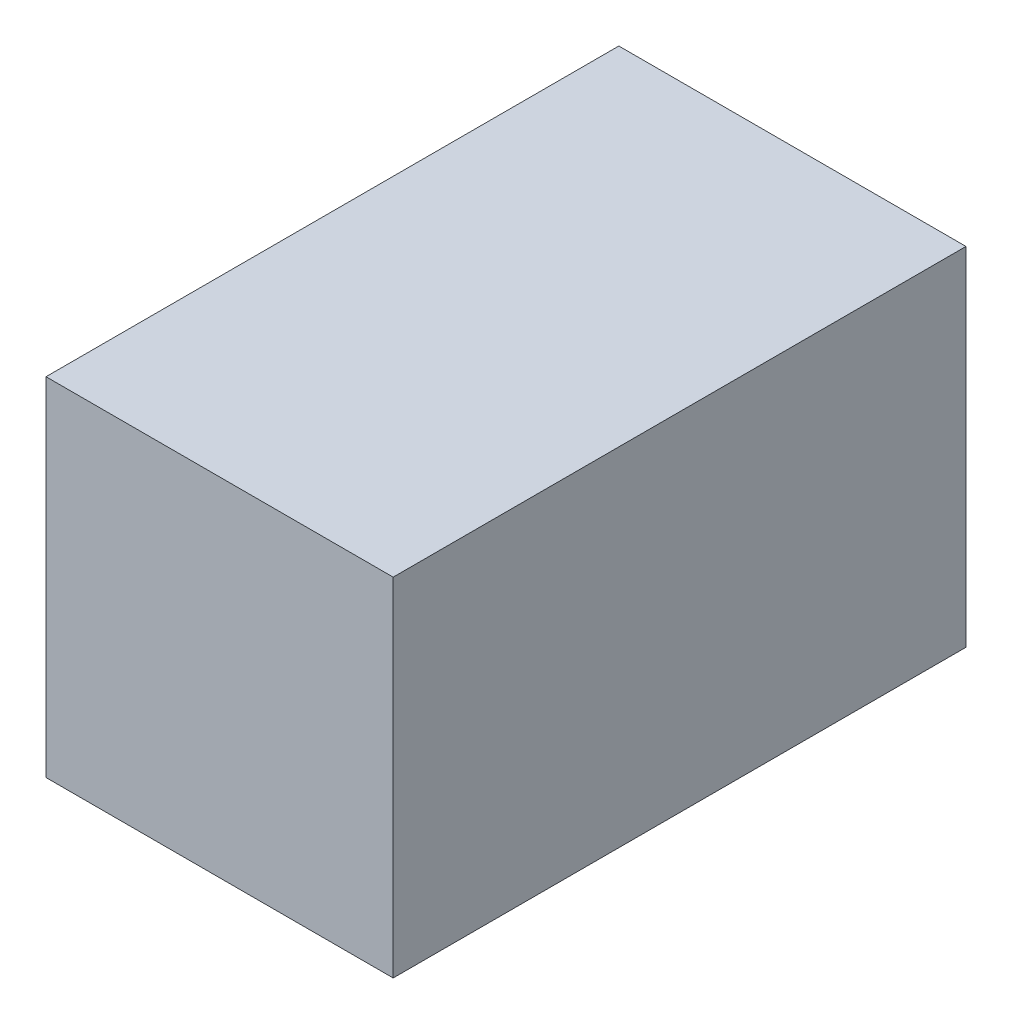
ISO-10303-21;
HEADER;
FILE_DESCRIPTION(('STEP AP214'),'2;1');
FILE_NAME('part.step','',(''),(''),'','','');
FILE_SCHEMA(('AUTOMOTIVE_DESIGN { 1 0 10303 214 1 1 1 1 }'));
ENDSEC;
DATA;
#1=APPLICATION_CONTEXT('core data for automotive mechanical design processes');
#2=APPLICATION_PROTOCOL_DEFINITION('international standard','automotive_design',2000,#1);
#3=PRODUCT_CONTEXT('',#1,'mechanical');
#4=PRODUCT('Part','Part','',(#3));
#5=PRODUCT_RELATED_PRODUCT_CATEGORY('part','',(#4));
#6=PRODUCT_DEFINITION_FORMATION('','',#4);
#7=PRODUCT_DEFINITION_CONTEXT('part definition',#1,'design');
#8=PRODUCT_DEFINITION('design','',#6,#7);
#9=PRODUCT_DEFINITION_SHAPE('','',#8);
#10=(LENGTH_UNIT() NAMED_UNIT(*) SI_UNIT(.MILLI.,.METRE.));
#11=(NAMED_UNIT(*) PLANE_ANGLE_UNIT() SI_UNIT($,.RADIAN.));
#12=(NAMED_UNIT(*) SI_UNIT($,.STERADIAN.) SOLID_ANGLE_UNIT());
#13=UNCERTAINTY_MEASURE_WITH_UNIT(LENGTH_MEASURE(1.E-05),#10,'distance_accuracy_value','');
#14=(GEOMETRIC_REPRESENTATION_CONTEXT(3) GLOBAL_UNCERTAINTY_ASSIGNED_CONTEXT((#13)) GLOBAL_UNIT_ASSIGNED_CONTEXT((#10,
#11,#12)) REPRESENTATION_CONTEXT('',''));
#15=CARTESIAN_POINT('',(0.,0.,0.));
#16=DIRECTION('',(0.,0.,1.));
#17=DIRECTION('',(1.,0.,0.));
#18=AXIS2_PLACEMENT_3D('',#15,#16,#17);
#19=CARTESIAN_POINT('',(-1.,2.,1.65));
#20=DIRECTION('',(1.,0.,0.));
#21=DIRECTION('',(0.,0.,-1.));
#22=AXIS2_PLACEMENT_3D('',#19,#20,#21);
#23=PLANE('',#22);
#24=DIRECTION('',(0.,0.,1.));
#25=VECTOR('',#24,1.);
#26=CARTESIAN_POINT('',(-1.,0.,1.65));
#27=LINE('',#26,#25);
#28=CARTESIAN_POINT('',(-1.,0.,-1.65));
#29=VERTEX_POINT('',#28);
#30=CARTESIAN_POINT('',(-1.,0.,1.65));
#31=VERTEX_POINT('',#30);
#32=EDGE_CURVE('E97',#29,#31,#27,.T.);
#33=ORIENTED_EDGE('',*,*,#32,.T.);
#34=DIRECTION('',(0.,-1.,0.));
#35=VECTOR('',#34,1.);
#36=CARTESIAN_POINT('',(-1.,2.,1.65));
#37=LINE('',#36,#35);
#38=CARTESIAN_POINT('',(-1.,2.,1.65));
#39=VERTEX_POINT('',#38);
#40=EDGE_CURVE('E11',#39,#31,#37,.T.);
#41=ORIENTED_EDGE('',*,*,#40,.F.);
#42=DIRECTION('',(0.,0.,1.));
#43=VECTOR('',#42,1.);
#44=CARTESIAN_POINT('',(-1.,2.,1.65));
#45=LINE('',#44,#43);
#46=CARTESIAN_POINT('',(-1.,2.,-1.65));
#47=VERTEX_POINT('',#46);
#48=EDGE_CURVE('E85',#47,#39,#45,.T.);
#49=ORIENTED_EDGE('',*,*,#48,.F.);
#50=DIRECTION('',(0.,-1.,0.));
#51=VECTOR('',#50,1.);
#52=CARTESIAN_POINT('',(-1.,2.,-1.65));
#53=LINE('',#52,#51);
#54=EDGE_CURVE('E93',#47,#29,#53,.T.);
#55=ORIENTED_EDGE('',*,*,#54,.T.);
#56=EDGE_LOOP('',(#33,#41,#49,#55));
#57=FACE_BOUND('',#56,.T.);
#58=ADVANCED_FACE('F34',(#57),#23,.F.);
#59=CARTESIAN_POINT('',(1.,2.,1.65));
#60=DIRECTION('',(0.,0.,-1.));
#61=DIRECTION('',(-1.,0.,0.));
#62=AXIS2_PLACEMENT_3D('',#59,#60,#61);
#63=PLANE('',#62);
#64=DIRECTION('',(1.,0.,0.));
#65=VECTOR('',#64,1.);
#66=CARTESIAN_POINT('',(1.,0.,1.65));
#67=LINE('',#66,#65);
#68=CARTESIAN_POINT('',(1.,0.,1.65));
#69=VERTEX_POINT('',#68);
#70=EDGE_CURVE('E89',#31,#69,#67,.T.);
#71=ORIENTED_EDGE('',*,*,#70,.T.);
#72=DIRECTION('',(0.,-1.,0.));
#73=VECTOR('',#72,1.);
#74=CARTESIAN_POINT('',(1.,2.,1.65));
#75=LINE('',#74,#73);
#76=CARTESIAN_POINT('',(1.,2.,1.65));
#77=VERTEX_POINT('',#76);
#78=EDGE_CURVE('E42',#77,#69,#75,.T.);
#79=ORIENTED_EDGE('',*,*,#78,.F.);
#80=DIRECTION('',(1.,0.,0.));
#81=VECTOR('',#80,1.);
#82=CARTESIAN_POINT('',(1.,2.,1.65));
#83=LINE('',#82,#81);
#84=EDGE_CURVE('E80',#39,#77,#83,.T.);
#85=ORIENTED_EDGE('',*,*,#84,.F.);
#86=ORIENTED_EDGE('',*,*,#40,.T.);
#87=EDGE_LOOP('',(#71,#79,#85,#86));
#88=FACE_BOUND('',#87,.T.);
#89=ADVANCED_FACE('F88',(#88),#63,.F.);
#90=CARTESIAN_POINT('',(1.,2.,1.65));
#91=DIRECTION('',(-1.,0.,0.));
#92=DIRECTION('',(0.,0.,1.));
#93=AXIS2_PLACEMENT_3D('',#90,#91,#92);
#94=PLANE('',#93);
#95=DIRECTION('',(0.,0.,-1.));
#96=VECTOR('',#95,1.);
#97=CARTESIAN_POINT('',(1.,0.,1.65));
#98=LINE('',#97,#96);
#99=CARTESIAN_POINT('',(1.,0.,-1.65));
#100=VERTEX_POINT('',#99);
#101=EDGE_CURVE('E67',#69,#100,#98,.T.);
#102=ORIENTED_EDGE('',*,*,#101,.T.);
#103=DIRECTION('',(0.,-1.,0.));
#104=VECTOR('',#103,1.);
#105=CARTESIAN_POINT('',(1.,2.,-1.65));
#106=LINE('',#105,#104);
#107=CARTESIAN_POINT('',(1.,2.,-1.65));
#108=VERTEX_POINT('',#107);
#109=EDGE_CURVE('E90',#108,#100,#106,.T.);
#110=ORIENTED_EDGE('',*,*,#109,.F.);
#111=DIRECTION('',(0.,0.,-1.));
#112=VECTOR('',#111,1.);
#113=CARTESIAN_POINT('',(1.,2.,1.65));
#114=LINE('',#113,#112);
#115=EDGE_CURVE('E83',#77,#108,#114,.T.);
#116=ORIENTED_EDGE('',*,*,#115,.F.);
#117=ORIENTED_EDGE('',*,*,#78,.T.);
#118=EDGE_LOOP('',(#102,#110,#116,#117));
#119=FACE_BOUND('',#118,.T.);
#120=ADVANCED_FACE('F91',(#119),#94,.F.);
#121=CARTESIAN_POINT('',(1.,2.,-1.65));
#122=DIRECTION('',(0.,0.,1.));
#123=DIRECTION('',(1.,0.,0.));
#124=AXIS2_PLACEMENT_3D('',#121,#122,#123);
#125=PLANE('',#124);
#126=DIRECTION('',(-1.,0.,0.));
#127=VECTOR('',#126,1.);
#128=CARTESIAN_POINT('',(1.,0.,-1.65));
#129=LINE('',#128,#127);
#130=EDGE_CURVE('E73',#100,#29,#129,.T.);
#131=ORIENTED_EDGE('',*,*,#130,.T.);
#132=ORIENTED_EDGE('',*,*,#54,.F.);
#133=DIRECTION('',(-1.,0.,0.));
#134=VECTOR('',#133,1.);
#135=CARTESIAN_POINT('',(1.,2.,-1.65));
#136=LINE('',#135,#134);
#137=EDGE_CURVE('E50',#108,#47,#136,.T.);
#138=ORIENTED_EDGE('',*,*,#137,.F.);
#139=ORIENTED_EDGE('',*,*,#109,.T.);
#140=EDGE_LOOP('',(#131,#132,#138,#139));
#141=FACE_BOUND('',#140,.T.);
#142=ADVANCED_FACE('F104',(#141),#125,.F.);
#143=CARTESIAN_POINT('',(0.,2.,0.));
#144=DIRECTION('',(0.,1.,0.));
#145=DIRECTION('',(0.,0.,1.));
#146=AXIS2_PLACEMENT_3D('',#143,#144,#145);
#147=PLANE('',#146);
#148=ORIENTED_EDGE('',*,*,#48,.T.);
#149=ORIENTED_EDGE('',*,*,#84,.T.);
#150=ORIENTED_EDGE('',*,*,#115,.T.);
#151=ORIENTED_EDGE('',*,*,#137,.T.);
#152=EDGE_LOOP('',(#148,#149,#150,#151));
#153=FACE_BOUND('',#152,.T.);
#154=ADVANCED_FACE('F81',(#153),#147,.T.);
#155=CARTESIAN_POINT('',(0.,0.,0.));
#156=DIRECTION('',(0.,1.,0.));
#157=DIRECTION('',(0.,0.,1.));
#158=AXIS2_PLACEMENT_3D('',#155,#156,#157);
#159=PLANE('',#158);
#160=ORIENTED_EDGE('',*,*,#32,.F.);
#161=ORIENTED_EDGE('',*,*,#130,.F.);
#162=ORIENTED_EDGE('',*,*,#101,.F.);
#163=ORIENTED_EDGE('',*,*,#70,.F.);
#164=EDGE_LOOP('',(#160,#161,#162,#163));
#165=FACE_BOUND('',#164,.T.);
#166=ADVANCED_FACE('F107',(#165),#159,.F.);
#167=CLOSED_SHELL('',(#58,#89,#120,#142,#154,#166));
#168=MANIFOLD_SOLID_BREP('B2',#167);
#169=ADVANCED_BREP_SHAPE_REPRESENTATION('',(#18,#168),#14);
#170=SHAPE_DEFINITION_REPRESENTATION(#9,#169);
ENDSEC;
END-ISO-10303-21;
